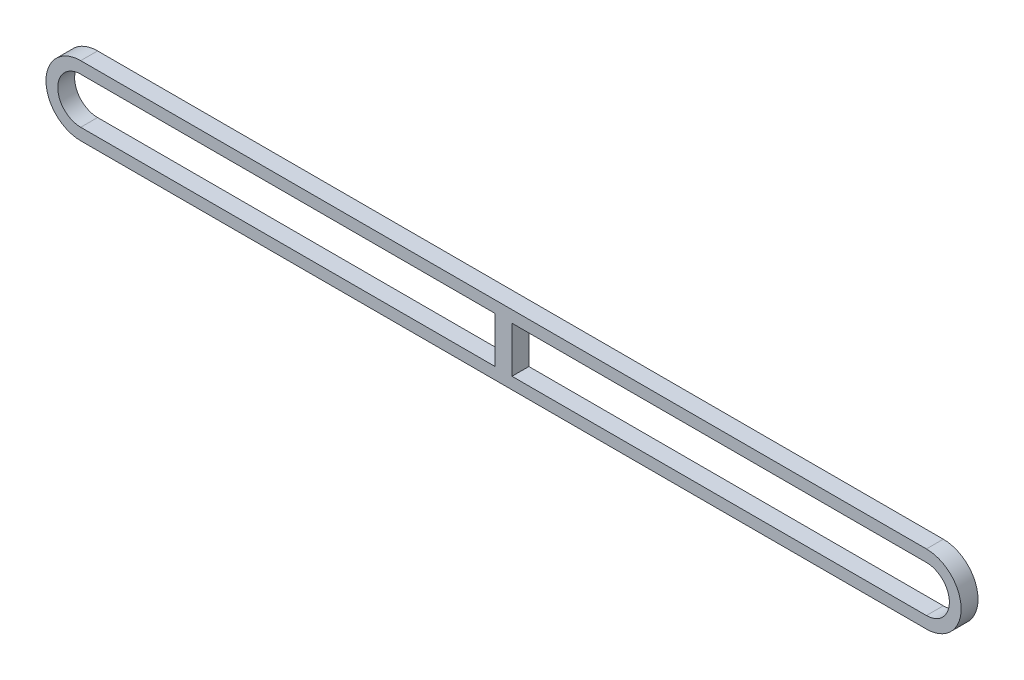
ISO-10303-21;
HEADER;
FILE_DESCRIPTION(('STEP AP214'),'2;1');
FILE_NAME('part.step','',(''),(''),'','','');
FILE_SCHEMA(('AUTOMOTIVE_DESIGN { 1 0 10303 214 1 1 1 1 }'));
ENDSEC;
DATA;
#1=APPLICATION_CONTEXT('core data for automotive mechanical design processes');
#2=APPLICATION_PROTOCOL_DEFINITION('international standard','automotive_design',2000,#1);
#3=PRODUCT_CONTEXT('',#1,'mechanical');
#4=PRODUCT('Part','Part','',(#3));
#5=PRODUCT_RELATED_PRODUCT_CATEGORY('part','',(#4));
#6=PRODUCT_DEFINITION_FORMATION('','',#4);
#7=PRODUCT_DEFINITION_CONTEXT('part definition',#1,'design');
#8=PRODUCT_DEFINITION('design','',#6,#7);
#9=PRODUCT_DEFINITION_SHAPE('','',#8);
#10=(LENGTH_UNIT() NAMED_UNIT(*) SI_UNIT(.MILLI.,.METRE.));
#11=(NAMED_UNIT(*) PLANE_ANGLE_UNIT() SI_UNIT($,.RADIAN.));
#12=(NAMED_UNIT(*) SI_UNIT($,.STERADIAN.) SOLID_ANGLE_UNIT());
#13=UNCERTAINTY_MEASURE_WITH_UNIT(LENGTH_MEASURE(1.E-05),#10,'distance_accuracy_value','');
#14=(GEOMETRIC_REPRESENTATION_CONTEXT(3) GLOBAL_UNCERTAINTY_ASSIGNED_CONTEXT((#13)) GLOBAL_UNIT_ASSIGNED_CONTEXT((#10,
#11,#12)) REPRESENTATION_CONTEXT('',''));
#15=CARTESIAN_POINT('',(0.,0.,0.));
#16=DIRECTION('',(0.,0.,1.));
#17=DIRECTION('',(1.,0.,0.));
#18=AXIS2_PLACEMENT_3D('',#15,#16,#17);
#19=CARTESIAN_POINT('',(0.,3.25,-2.3876));
#20=DIRECTION('',(0.,1.,0.));
#21=DIRECTION('',(-1.,0.,0.));
#22=AXIS2_PLACEMENT_3D('',#19,#20,#21);
#23=PLANE('',#22);
#24=DIRECTION('',(0.,0.,-1.));
#25=VECTOR('',#24,1.);
#26=CARTESIAN_POINT('',(58.6247,3.24999999997999,0.));
#27=LINE('',#26,#25);
#28=CARTESIAN_POINT('',(58.6247,3.25000000009368,0.));
#29=VERTEX_POINT('',#28);
#30=CARTESIAN_POINT('',(58.6247,3.25,-2.3876));
#31=VERTEX_POINT('',#30);
#32=EDGE_CURVE('E145',#29,#31,#27,.T.);
#33=ORIENTED_EDGE('',*,*,#32,.F.);
#34=DIRECTION('',(-1.,0.,0.));
#35=VECTOR('',#34,1.);
#36=CARTESIAN_POINT('',(0.,3.25,0.));
#37=LINE('',#36,#35);
#38=CARTESIAN_POINT('',(0.,3.25,0.));
#39=VERTEX_POINT('',#38);
#40=EDGE_CURVE('E133',#29,#39,#37,.T.);
#41=ORIENTED_EDGE('',*,*,#40,.T.);
#42=DIRECTION('',(0.,0.,1.));
#43=VECTOR('',#42,1.);
#44=CARTESIAN_POINT('',(0.,3.25,-2.3876));
#45=LINE('',#44,#43);
#46=CARTESIAN_POINT('',(0.,3.25,-2.3876));
#47=VERTEX_POINT('',#46);
#48=EDGE_CURVE('E180',#47,#39,#45,.T.);
#49=ORIENTED_EDGE('',*,*,#48,.F.);
#50=DIRECTION('',(-1.,0.,0.));
#51=VECTOR('',#50,1.);
#52=CARTESIAN_POINT('',(0.,3.25,-2.3876));
#53=LINE('',#52,#51);
#54=EDGE_CURVE('E58',#31,#47,#53,.T.);
#55=ORIENTED_EDGE('',*,*,#54,.F.);
#56=EDGE_LOOP('',(#33,#41,#49,#55));
#57=FACE_BOUND('',#56,.T.);
#58=ADVANCED_FACE('F41',(#57),#23,.F.);
#59=CARTESIAN_POINT('',(0.,-3.25,-2.3876));
#60=DIRECTION('',(0.,-1.,0.));
#61=DIRECTION('',(1.,0.,0.));
#62=AXIS2_PLACEMENT_3D('',#59,#60,#61);
#63=PLANE('',#62);
#64=DIRECTION('',(0.,0.,-1.));
#65=VECTOR('',#64,1.);
#66=CARTESIAN_POINT('',(58.6247,-3.24999999997999,0.));
#67=LINE('',#66,#65);
#68=CARTESIAN_POINT('',(58.6247,-3.25,0.));
#69=VERTEX_POINT('',#68);
#70=CARTESIAN_POINT('',(58.6247,-3.25,-2.3876));
#71=VERTEX_POINT('',#70);
#72=EDGE_CURVE('E148',#69,#71,#67,.T.);
#73=ORIENTED_EDGE('',*,*,#72,.T.);
#74=DIRECTION('',(1.,0.,0.));
#75=VECTOR('',#74,1.);
#76=CARTESIAN_POINT('',(0.,-3.25,-2.3876));
#77=LINE('',#76,#75);
#78=CARTESIAN_POINT('',(0.,-3.25,-2.3876));
#79=VERTEX_POINT('',#78);
#80=EDGE_CURVE('E167',#79,#71,#77,.T.);
#81=ORIENTED_EDGE('',*,*,#80,.F.);
#82=DIRECTION('',(0.,0.,1.));
#83=VECTOR('',#82,1.);
#84=CARTESIAN_POINT('',(0.,-3.25,-2.3876));
#85=LINE('',#84,#83);
#86=CARTESIAN_POINT('',(0.,-3.25,0.));
#87=VERTEX_POINT('',#86);
#88=EDGE_CURVE('E174',#79,#87,#85,.T.);
#89=ORIENTED_EDGE('',*,*,#88,.T.);
#90=DIRECTION('',(1.,0.,0.));
#91=VECTOR('',#90,1.);
#92=CARTESIAN_POINT('',(0.,-3.25,0.));
#93=LINE('',#92,#91);
#94=EDGE_CURVE('E176',#87,#69,#93,.T.);
#95=ORIENTED_EDGE('',*,*,#94,.T.);
#96=EDGE_LOOP('',(#73,#81,#89,#95));
#97=FACE_BOUND('',#96,.T.);
#98=ADVANCED_FACE('F241',(#97),#63,.F.);
#99=CARTESIAN_POINT('',(0.,0.,-2.3876));
#100=DIRECTION('',(0.,0.,1.));
#101=DIRECTION('',(1.,0.,0.));
#102=AXIS2_PLACEMENT_3D('',#99,#100,#101);
#103=CYLINDRICAL_SURFACE('',#102,4.91087);
#104=CARTESIAN_POINT('',(0.,0.,0.));
#105=DIRECTION('',(0.,0.,1.));
#106=DIRECTION('',(1.,0.,0.));
#107=AXIS2_PLACEMENT_3D('',#104,#105,#106);
#108=CIRCLE('',#107,4.91087);
#109=CARTESIAN_POINT('',(0.,4.91087,0.));
#110=VERTEX_POINT('',#109);
#111=CARTESIAN_POINT('',(0.,-4.91087,0.));
#112=VERTEX_POINT('',#111);
#113=EDGE_CURVE('E182',#110,#112,#108,.T.);
#114=ORIENTED_EDGE('',*,*,#113,.F.);
#115=DIRECTION('',(0.,0.,1.));
#116=VECTOR('',#115,1.);
#117=CARTESIAN_POINT('',(0.,4.91087,-2.3876));
#118=LINE('',#117,#116);
#119=CARTESIAN_POINT('',(0.,4.91087,-2.3876));
#120=VERTEX_POINT('',#119);
#121=EDGE_CURVE('E12',#120,#110,#118,.T.);
#122=ORIENTED_EDGE('',*,*,#121,.F.);
#123=CARTESIAN_POINT('',(0.,0.,-2.3876));
#124=DIRECTION('',(0.,0.,1.));
#125=DIRECTION('',(1.,0.,0.));
#126=AXIS2_PLACEMENT_3D('',#123,#124,#125);
#127=CIRCLE('',#126,4.91087);
#128=CARTESIAN_POINT('',(0.,-4.91087,-2.3876));
#129=VERTEX_POINT('',#128);
#130=EDGE_CURVE('E190',#120,#129,#127,.T.);
#131=ORIENTED_EDGE('',*,*,#130,.T.);
#132=DIRECTION('',(0.,0.,1.));
#133=VECTOR('',#132,1.);
#134=CARTESIAN_POINT('',(0.,-4.91087,-2.3876));
#135=LINE('',#134,#133);
#136=EDGE_CURVE('E45',#129,#112,#135,.T.);
#137=ORIENTED_EDGE('',*,*,#136,.T.);
#138=EDGE_LOOP('',(#114,#122,#131,#137));
#139=FACE_BOUND('',#138,.T.);
#140=ADVANCED_FACE('F43',(#139),#103,.T.);
#141=CARTESIAN_POINT('',(0.,4.91087,-2.3876));
#142=DIRECTION('',(0.,1.,0.));
#143=DIRECTION('',(0.,0.,1.));
#144=AXIS2_PLACEMENT_3D('',#141,#142,#143);
#145=PLANE('',#144);
#146=DIRECTION('',(-1.,0.,0.));
#147=VECTOR('',#146,1.);
#148=CARTESIAN_POINT('',(0.,4.91087,0.));
#149=LINE('',#148,#147);
#150=CARTESIAN_POINT('',(119.637,4.91087,0.));
#151=VERTEX_POINT('',#150);
#152=EDGE_CURVE('E194',#151,#110,#149,.T.);
#153=ORIENTED_EDGE('',*,*,#152,.F.);
#154=DIRECTION('',(0.,0.,1.));
#155=VECTOR('',#154,1.);
#156=CARTESIAN_POINT('',(119.637,4.91087,-2.3876));
#157=LINE('',#156,#155);
#158=CARTESIAN_POINT('',(119.637,4.91087,-2.3876));
#159=VERTEX_POINT('',#158);
#160=EDGE_CURVE('E50',#159,#151,#157,.T.);
#161=ORIENTED_EDGE('',*,*,#160,.F.);
#162=DIRECTION('',(-1.,0.,0.));
#163=VECTOR('',#162,1.);
#164=CARTESIAN_POINT('',(0.,4.91087,-2.3876));
#165=LINE('',#164,#163);
#166=EDGE_CURVE('E200',#159,#120,#165,.T.);
#167=ORIENTED_EDGE('',*,*,#166,.T.);
#168=ORIENTED_EDGE('',*,*,#121,.T.);
#169=EDGE_LOOP('',(#153,#161,#167,#168));
#170=FACE_BOUND('',#169,.T.);
#171=ADVANCED_FACE('F226',(#170),#145,.T.);
#172=CARTESIAN_POINT('',(119.637,0.,-2.3876));
#173=DIRECTION('',(0.,0.,1.));
#174=DIRECTION('',(1.,0.,0.));
#175=AXIS2_PLACEMENT_3D('',#172,#173,#174);
#176=CYLINDRICAL_SURFACE('',#175,4.91087);
#177=CARTESIAN_POINT('',(119.637,0.,0.));
#178=DIRECTION('',(0.,0.,1.));
#179=DIRECTION('',(1.,0.,0.));
#180=AXIS2_PLACEMENT_3D('',#177,#178,#179);
#181=CIRCLE('',#180,4.91087);
#182=CARTESIAN_POINT('',(119.637,-4.91087,0.));
#183=VERTEX_POINT('',#182);
#184=EDGE_CURVE('E208',#183,#151,#181,.T.);
#185=ORIENTED_EDGE('',*,*,#184,.F.);
#186=DIRECTION('',(0.,0.,1.));
#187=VECTOR('',#186,1.);
#188=CARTESIAN_POINT('',(119.637,-4.91087,-2.3876));
#189=LINE('',#188,#187);
#190=CARTESIAN_POINT('',(119.637,-4.91087,-2.3876));
#191=VERTEX_POINT('',#190);
#192=EDGE_CURVE('E214',#191,#183,#189,.T.);
#193=ORIENTED_EDGE('',*,*,#192,.F.);
#194=CARTESIAN_POINT('',(119.637,0.,-2.3876));
#195=DIRECTION('',(0.,0.,1.));
#196=DIRECTION('',(1.,0.,0.));
#197=AXIS2_PLACEMENT_3D('',#194,#195,#196);
#198=CIRCLE('',#197,4.91087);
#199=EDGE_CURVE('E197',#191,#159,#198,.T.);
#200=ORIENTED_EDGE('',*,*,#199,.T.);
#201=ORIENTED_EDGE('',*,*,#160,.T.);
#202=EDGE_LOOP('',(#185,#193,#200,#201));
#203=FACE_BOUND('',#202,.T.);
#204=ADVANCED_FACE('F232',(#203),#176,.T.);
#205=CARTESIAN_POINT('',(0.,-4.91087,-2.3876));
#206=DIRECTION('',(0.,-1.,0.));
#207=DIRECTION('',(0.,0.,-1.));
#208=AXIS2_PLACEMENT_3D('',#205,#206,#207);
#209=PLANE('',#208);
#210=DIRECTION('',(1.,0.,0.));
#211=VECTOR('',#210,1.);
#212=CARTESIAN_POINT('',(0.,-4.91087,0.));
#213=LINE('',#212,#211);
#214=EDGE_CURVE('E204',#112,#183,#213,.T.);
#215=ORIENTED_EDGE('',*,*,#214,.F.);
#216=ORIENTED_EDGE('',*,*,#136,.F.);
#217=DIRECTION('',(1.,0.,0.));
#218=VECTOR('',#217,1.);
#219=CARTESIAN_POINT('',(0.,-4.91087,-2.3876));
#220=LINE('',#219,#218);
#221=EDGE_CURVE('E193',#129,#191,#220,.T.);
#222=ORIENTED_EDGE('',*,*,#221,.T.);
#223=ORIENTED_EDGE('',*,*,#192,.T.);
#224=EDGE_LOOP('',(#215,#216,#222,#223));
#225=FACE_BOUND('',#224,.T.);
#226=ADVANCED_FACE('F222',(#225),#209,.T.);
#227=CARTESIAN_POINT('',(0.,0.,-2.3876));
#228=DIRECTION('',(0.,0.,1.));
#229=DIRECTION('',(1.,0.,0.));
#230=AXIS2_PLACEMENT_3D('',#227,#228,#229);
#231=PLANE('',#230);
#232=DIRECTION('',(0.,1.,0.));
#233=VECTOR('',#232,1.);
#234=CARTESIAN_POINT('',(58.6247,-500000.,-2.3876));
#235=LINE('',#234,#233);
#236=EDGE_CURVE('E274',#71,#31,#235,.T.);
#237=ORIENTED_EDGE('',*,*,#236,.T.);
#238=ORIENTED_EDGE('',*,*,#54,.T.);
#239=CARTESIAN_POINT('',(0.,0.,-2.3876));
#240=DIRECTION('',(0.,0.,1.));
#241=DIRECTION('',(1.,0.,0.));
#242=AXIS2_PLACEMENT_3D('',#239,#240,#241);
#243=CIRCLE('',#242,3.25);
#244=EDGE_CURVE('E163',#47,#79,#243,.T.);
#245=ORIENTED_EDGE('',*,*,#244,.T.);
#246=ORIENTED_EDGE('',*,*,#80,.T.);
#247=EDGE_LOOP('',(#237,#238,#245,#246));
#248=FACE_BOUND('',#247,.T.);
#249=CARTESIAN_POINT('',(119.637,3.25,-2.3876));
#250=VERTEX_POINT('',#249);
#251=CARTESIAN_POINT('',(61.0123,3.25,-2.3876));
#252=VERTEX_POINT('',#251);
#253=EDGE_CURVE('E173',#250,#252,#53,.T.);
#254=ORIENTED_EDGE('',*,*,#253,.T.);
#255=DIRECTION('',(0.,1.,0.));
#256=VECTOR('',#255,1.);
#257=CARTESIAN_POINT('',(61.0123,-500000.,-2.3876));
#258=LINE('',#257,#256);
#259=CARTESIAN_POINT('',(61.0123,-3.25,-2.3876));
#260=VERTEX_POINT('',#259);
#261=EDGE_CURVE('E157',#260,#252,#258,.T.);
#262=ORIENTED_EDGE('',*,*,#261,.F.);
#263=CARTESIAN_POINT('',(119.637,-3.25,-2.3876));
#264=VERTEX_POINT('',#263);
#265=EDGE_CURVE('E166',#260,#264,#77,.T.);
#266=ORIENTED_EDGE('',*,*,#265,.T.);
#267=CARTESIAN_POINT('',(119.637,0.,-2.3876));
#268=DIRECTION('',(0.,0.,1.));
#269=DIRECTION('',(1.,0.,0.));
#270=AXIS2_PLACEMENT_3D('',#267,#268,#269);
#271=CIRCLE('',#270,3.25);
#272=EDGE_CURVE('E170',#264,#250,#271,.T.);
#273=ORIENTED_EDGE('',*,*,#272,.T.);
#274=EDGE_LOOP('',(#254,#262,#266,#273));
#275=FACE_BOUND('',#274,.T.);
#276=ORIENTED_EDGE('',*,*,#130,.F.);
#277=ORIENTED_EDGE('',*,*,#166,.F.);
#278=ORIENTED_EDGE('',*,*,#199,.F.);
#279=ORIENTED_EDGE('',*,*,#221,.F.);
#280=EDGE_LOOP('',(#276,#277,#278,#279));
#281=FACE_BOUND('',#280,.T.);
#282=ADVANCED_FACE('F229',(#248,#275,#281),#231,.F.);
#283=CARTESIAN_POINT('',(0.,0.,0.));
#284=DIRECTION('',(0.,0.,1.));
#285=DIRECTION('',(1.,0.,0.));
#286=AXIS2_PLACEMENT_3D('',#283,#284,#285);
#287=PLANE('',#286);
#288=ORIENTED_EDGE('',*,*,#40,.F.);
#289=DIRECTION('',(0.,1.,0.));
#290=VECTOR('',#289,1.);
#291=CARTESIAN_POINT('',(58.6247,-500000.,0.));
#292=LINE('',#291,#290);
#293=EDGE_CURVE('E138',#69,#29,#292,.T.);
#294=ORIENTED_EDGE('',*,*,#293,.F.);
#295=ORIENTED_EDGE('',*,*,#94,.F.);
#296=CARTESIAN_POINT('',(0.,0.,0.));
#297=DIRECTION('',(0.,0.,1.));
#298=DIRECTION('',(1.,0.,0.));
#299=AXIS2_PLACEMENT_3D('',#296,#297,#298);
#300=CIRCLE('',#299,3.25);
#301=EDGE_CURVE('E139',#39,#87,#300,.T.);
#302=ORIENTED_EDGE('',*,*,#301,.F.);
#303=EDGE_LOOP('',(#288,#294,#295,#302));
#304=FACE_BOUND('',#303,.T.);
#305=DIRECTION('',(0.,1.,0.));
#306=VECTOR('',#305,1.);
#307=CARTESIAN_POINT('',(61.0123,-500000.,0.));
#308=LINE('',#307,#306);
#309=CARTESIAN_POINT('',(61.0123,-3.25000000009368,0.));
#310=VERTEX_POINT('',#309);
#311=CARTESIAN_POINT('',(61.0123,3.25,0.));
#312=VERTEX_POINT('',#311);
#313=EDGE_CURVE('E152',#310,#312,#308,.T.);
#314=ORIENTED_EDGE('',*,*,#313,.T.);
#315=CARTESIAN_POINT('',(119.637,3.25,0.));
#316=VERTEX_POINT('',#315);
#317=EDGE_CURVE('E141',#316,#312,#37,.T.);
#318=ORIENTED_EDGE('',*,*,#317,.F.);
#319=CARTESIAN_POINT('',(119.637,0.,0.));
#320=DIRECTION('',(0.,0.,1.));
#321=DIRECTION('',(1.,0.,0.));
#322=AXIS2_PLACEMENT_3D('',#319,#320,#321);
#323=CIRCLE('',#322,3.25);
#324=CARTESIAN_POINT('',(119.637,-3.25,0.));
#325=VERTEX_POINT('',#324);
#326=EDGE_CURVE('E142',#325,#316,#323,.T.);
#327=ORIENTED_EDGE('',*,*,#326,.F.);
#328=EDGE_CURVE('E154',#310,#325,#93,.T.);
#329=ORIENTED_EDGE('',*,*,#328,.F.);
#330=EDGE_LOOP('',(#314,#318,#327,#329));
#331=FACE_BOUND('',#330,.T.);
#332=ORIENTED_EDGE('',*,*,#113,.T.);
#333=ORIENTED_EDGE('',*,*,#214,.T.);
#334=ORIENTED_EDGE('',*,*,#184,.T.);
#335=ORIENTED_EDGE('',*,*,#152,.T.);
#336=EDGE_LOOP('',(#332,#333,#334,#335));
#337=FACE_BOUND('',#336,.T.);
#338=ADVANCED_FACE('F134',(#304,#331,#337),#287,.T.);
#339=CARTESIAN_POINT('',(0.,0.,-2.3876));
#340=DIRECTION('',(0.,0.,1.));
#341=DIRECTION('',(1.,0.,0.));
#342=AXIS2_PLACEMENT_3D('',#339,#340,#341);
#343=CYLINDRICAL_SURFACE('',#342,3.25);
#344=ORIENTED_EDGE('',*,*,#301,.T.);
#345=ORIENTED_EDGE('',*,*,#88,.F.);
#346=ORIENTED_EDGE('',*,*,#244,.F.);
#347=ORIENTED_EDGE('',*,*,#48,.T.);
#348=EDGE_LOOP('',(#344,#345,#346,#347));
#349=FACE_BOUND('',#348,.T.);
#350=ADVANCED_FACE('F254',(#349),#343,.F.);
#351=ORIENTED_EDGE('',*,*,#317,.T.);
#352=DIRECTION('',(0.,0.,-1.));
#353=VECTOR('',#352,1.);
#354=CARTESIAN_POINT('',(61.0123,3.24999999997999,0.));
#355=LINE('',#354,#353);
#356=EDGE_CURVE('E66',#312,#252,#355,.T.);
#357=ORIENTED_EDGE('',*,*,#356,.T.);
#358=ORIENTED_EDGE('',*,*,#253,.F.);
#359=DIRECTION('',(0.,0.,1.));
#360=VECTOR('',#359,1.);
#361=CARTESIAN_POINT('',(119.637,3.25,-2.3876));
#362=LINE('',#361,#360);
#363=EDGE_CURVE('E183',#250,#316,#362,.T.);
#364=ORIENTED_EDGE('',*,*,#363,.T.);
#365=EDGE_LOOP('',(#351,#357,#358,#364));
#366=FACE_BOUND('',#365,.T.);
#367=ADVANCED_FACE('F243',(#366),#23,.F.);
#368=CARTESIAN_POINT('',(119.637,0.,-2.3876));
#369=DIRECTION('',(0.,0.,1.));
#370=DIRECTION('',(1.,0.,0.));
#371=AXIS2_PLACEMENT_3D('',#368,#369,#370);
#372=CYLINDRICAL_SURFACE('',#371,3.25);
#373=ORIENTED_EDGE('',*,*,#326,.T.);
#374=ORIENTED_EDGE('',*,*,#363,.F.);
#375=ORIENTED_EDGE('',*,*,#272,.F.);
#376=DIRECTION('',(0.,0.,1.));
#377=VECTOR('',#376,1.);
#378=CARTESIAN_POINT('',(119.637,-3.25,-2.3876));
#379=LINE('',#378,#377);
#380=EDGE_CURVE('E185',#264,#325,#379,.T.);
#381=ORIENTED_EDGE('',*,*,#380,.T.);
#382=EDGE_LOOP('',(#373,#374,#375,#381));
#383=FACE_BOUND('',#382,.T.);
#384=ADVANCED_FACE('F253',(#383),#372,.F.);
#385=ORIENTED_EDGE('',*,*,#265,.F.);
#386=DIRECTION('',(0.,0.,-1.));
#387=VECTOR('',#386,1.);
#388=CARTESIAN_POINT('',(61.0123,-3.24999999997999,0.));
#389=LINE('',#388,#387);
#390=EDGE_CURVE('E162',#310,#260,#389,.T.);
#391=ORIENTED_EDGE('',*,*,#390,.F.);
#392=ORIENTED_EDGE('',*,*,#328,.T.);
#393=ORIENTED_EDGE('',*,*,#380,.F.);
#394=EDGE_LOOP('',(#385,#391,#392,#393));
#395=FACE_BOUND('',#394,.T.);
#396=ADVANCED_FACE('F249',(#395),#63,.F.);
#397=CARTESIAN_POINT('',(61.0123,-500000.,0.));
#398=DIRECTION('',(1.,0.,0.));
#399=DIRECTION('',(0.,0.,-1.));
#400=AXIS2_PLACEMENT_3D('',#397,#398,#399);
#401=PLANE('',#400);
#402=ORIENTED_EDGE('',*,*,#313,.F.);
#403=ORIENTED_EDGE('',*,*,#390,.T.);
#404=ORIENTED_EDGE('',*,*,#261,.T.);
#405=ORIENTED_EDGE('',*,*,#356,.F.);
#406=EDGE_LOOP('',(#402,#403,#404,#405));
#407=FACE_BOUND('',#406,.T.);
#408=ADVANCED_FACE('F269',(#407),#401,.T.);
#409=CARTESIAN_POINT('',(58.6247,-500000.,0.));
#410=DIRECTION('',(1.,0.,0.));
#411=DIRECTION('',(0.,0.,-1.));
#412=AXIS2_PLACEMENT_3D('',#409,#410,#411);
#413=PLANE('',#412);
#414=ORIENTED_EDGE('',*,*,#72,.F.);
#415=ORIENTED_EDGE('',*,*,#293,.T.);
#416=ORIENTED_EDGE('',*,*,#32,.T.);
#417=ORIENTED_EDGE('',*,*,#236,.F.);
#418=EDGE_LOOP('',(#414,#415,#416,#417));
#419=FACE_BOUND('',#418,.T.);
#420=ADVANCED_FACE('F151',(#419),#413,.F.);
#421=CLOSED_SHELL('',(#58,#98,#140,#171,#204,#226,#282,#338,#350,#367,#384,#396,#408,#420));
#422=MANIFOLD_SOLID_BREP('B2',#421);
#423=ADVANCED_BREP_SHAPE_REPRESENTATION('',(#18,#422),#14);
#424=SHAPE_DEFINITION_REPRESENTATION(#9,#423);
ENDSEC;
END-ISO-10303-21;
